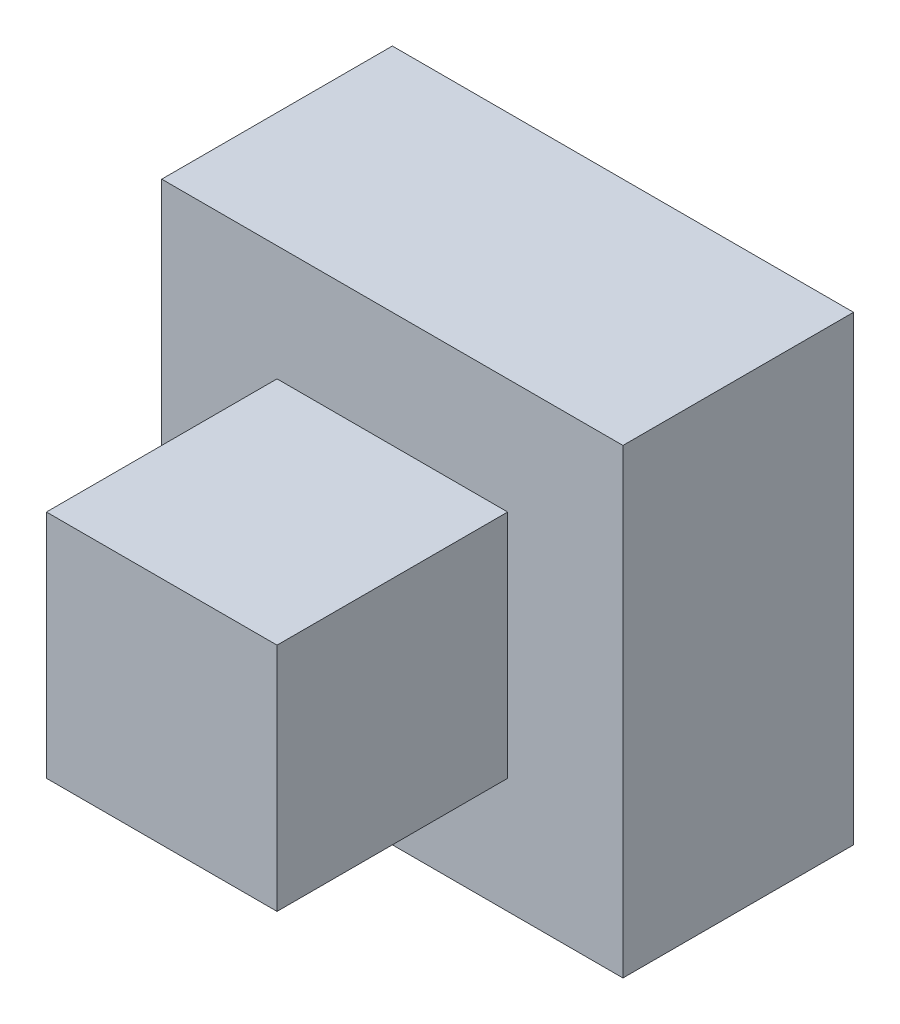
ISO-10303-21;
HEADER;
FILE_DESCRIPTION(('STEP AP214'),'2;1');
FILE_NAME('part.step','',(''),(''),'','','');
FILE_SCHEMA(('AUTOMOTIVE_DESIGN { 1 0 10303 214 1 1 1 1 }'));
ENDSEC;
DATA;
#1=APPLICATION_CONTEXT('core data for automotive mechanical design processes');
#2=APPLICATION_PROTOCOL_DEFINITION('international standard','automotive_design',2000,#1);
#3=PRODUCT_CONTEXT('',#1,'mechanical');
#4=PRODUCT('Part','Part','',(#3));
#5=PRODUCT_RELATED_PRODUCT_CATEGORY('part','',(#4));
#6=PRODUCT_DEFINITION_FORMATION('','',#4);
#7=PRODUCT_DEFINITION_CONTEXT('part definition',#1,'design');
#8=PRODUCT_DEFINITION('design','',#6,#7);
#9=PRODUCT_DEFINITION_SHAPE('','',#8);
#10=(LENGTH_UNIT() NAMED_UNIT(*) SI_UNIT(.MILLI.,.METRE.));
#11=(NAMED_UNIT(*) PLANE_ANGLE_UNIT() SI_UNIT($,.RADIAN.));
#12=(NAMED_UNIT(*) SI_UNIT($,.STERADIAN.) SOLID_ANGLE_UNIT());
#13=UNCERTAINTY_MEASURE_WITH_UNIT(LENGTH_MEASURE(1.E-05),#10,'distance_accuracy_value','');
#14=(GEOMETRIC_REPRESENTATION_CONTEXT(3) GLOBAL_UNCERTAINTY_ASSIGNED_CONTEXT((#13)) GLOBAL_UNIT_ASSIGNED_CONTEXT((#10,
#11,#12)) REPRESENTATION_CONTEXT('',''));
#15=CARTESIAN_POINT('',(0.,0.,0.));
#16=DIRECTION('',(0.,0.,1.));
#17=DIRECTION('',(1.,0.,0.));
#18=AXIS2_PLACEMENT_3D('',#15,#16,#17);
#19=CARTESIAN_POINT('',(0.,0.,10.));
#20=DIRECTION('',(0.,0.,-1.));
#21=DIRECTION('',(-1.,0.,0.));
#22=AXIS2_PLACEMENT_3D('',#19,#20,#21);
#23=PLANE('',#22);
#24=DIRECTION('',(0.,-1.,0.));
#25=VECTOR('',#24,1.);
#26=CARTESIAN_POINT('',(0.,0.,10.));
#27=LINE('',#26,#25);
#28=CARTESIAN_POINT('',(0.,20.,10.));
#29=VERTEX_POINT('',#28);
#30=CARTESIAN_POINT('',(0.,0.,10.));
#31=VERTEX_POINT('',#30);
#32=EDGE_CURVE('E140',#29,#31,#27,.T.);
#33=ORIENTED_EDGE('',*,*,#32,.T.);
#34=DIRECTION('',(1.,0.,0.));
#35=VECTOR('',#34,1.);
#36=CARTESIAN_POINT('',(0.,0.,10.));
#37=LINE('',#36,#35);
#38=CARTESIAN_POINT('',(20.,0.,10.));
#39=VERTEX_POINT('',#38);
#40=EDGE_CURVE('E141',#31,#39,#37,.T.);
#41=ORIENTED_EDGE('',*,*,#40,.T.);
#42=DIRECTION('',(0.,1.,0.));
#43=VECTOR('',#42,1.);
#44=CARTESIAN_POINT('',(20.,0.,10.));
#45=LINE('',#44,#43);
#46=CARTESIAN_POINT('',(20.,20.,10.));
#47=VERTEX_POINT('',#46);
#48=EDGE_CURVE('E148',#39,#47,#45,.T.);
#49=ORIENTED_EDGE('',*,*,#48,.T.);
#50=DIRECTION('',(-1.,0.,0.));
#51=VECTOR('',#50,1.);
#52=CARTESIAN_POINT('',(0.,20.,10.));
#53=LINE('',#52,#51);
#54=EDGE_CURVE('E146',#47,#29,#53,.T.);
#55=ORIENTED_EDGE('',*,*,#54,.T.);
#56=EDGE_LOOP('',(#33,#41,#49,#55));
#57=FACE_BOUND('',#56,.T.);
#58=DIRECTION('',(0.,-1.,0.));
#59=VECTOR('',#58,1.);
#60=CARTESIAN_POINT('',(5.,5.,10.));
#61=LINE('',#60,#59);
#62=CARTESIAN_POINT('',(5.,15.,10.));
#63=VERTEX_POINT('',#62);
#64=CARTESIAN_POINT('',(5.,5.,10.));
#65=VERTEX_POINT('',#64);
#66=EDGE_CURVE('E130',#63,#65,#61,.T.);
#67=ORIENTED_EDGE('',*,*,#66,.F.);
#68=DIRECTION('',(-1.,0.,0.));
#69=VECTOR('',#68,1.);
#70=CARTESIAN_POINT('',(5.,15.,10.));
#71=LINE('',#70,#69);
#72=CARTESIAN_POINT('',(15.,15.,10.));
#73=VERTEX_POINT('',#72);
#74=EDGE_CURVE('E136',#73,#63,#71,.T.);
#75=ORIENTED_EDGE('',*,*,#74,.F.);
#76=DIRECTION('',(0.,1.,0.));
#77=VECTOR('',#76,1.);
#78=CARTESIAN_POINT('',(15.,5.,10.));
#79=LINE('',#78,#77);
#80=CARTESIAN_POINT('',(15.,5.,10.));
#81=VERTEX_POINT('',#80);
#82=EDGE_CURVE('E62',#81,#73,#79,.T.);
#83=ORIENTED_EDGE('',*,*,#82,.F.);
#84=DIRECTION('',(1.,0.,0.));
#85=VECTOR('',#84,1.);
#86=CARTESIAN_POINT('',(5.,5.,10.));
#87=LINE('',#86,#85);
#88=EDGE_CURVE('E59',#65,#81,#87,.T.);
#89=ORIENTED_EDGE('',*,*,#88,.F.);
#90=EDGE_LOOP('',(#67,#75,#83,#89));
#91=FACE_BOUND('',#90,.T.);
#92=ADVANCED_FACE('F43',(#57,#91),#23,.F.);
#93=CARTESIAN_POINT('',(0.,0.,10.));
#94=DIRECTION('',(1.,0.,0.));
#95=DIRECTION('',(0.,0.,-1.));
#96=AXIS2_PLACEMENT_3D('',#93,#94,#95);
#97=PLANE('',#96);
#98=DIRECTION('',(0.,-1.,0.));
#99=VECTOR('',#98,1.);
#100=CARTESIAN_POINT('',(0.,0.,0.));
#101=LINE('',#100,#99);
#102=CARTESIAN_POINT('',(0.,20.,0.));
#103=VERTEX_POINT('',#102);
#104=CARTESIAN_POINT('',(0.,0.,0.));
#105=VERTEX_POINT('',#104);
#106=EDGE_CURVE('E138',#103,#105,#101,.T.);
#107=ORIENTED_EDGE('',*,*,#106,.T.);
#108=DIRECTION('',(0.,0.,-1.));
#109=VECTOR('',#108,1.);
#110=CARTESIAN_POINT('',(0.,0.,10.));
#111=LINE('',#110,#109);
#112=EDGE_CURVE('E11',#31,#105,#111,.T.);
#113=ORIENTED_EDGE('',*,*,#112,.F.);
#114=ORIENTED_EDGE('',*,*,#32,.F.);
#115=DIRECTION('',(0.,0.,-1.));
#116=VECTOR('',#115,1.);
#117=CARTESIAN_POINT('',(0.,20.,10.));
#118=LINE('',#117,#116);
#119=EDGE_CURVE('E147',#29,#103,#118,.T.);
#120=ORIENTED_EDGE('',*,*,#119,.T.);
#121=EDGE_LOOP('',(#107,#113,#114,#120));
#122=FACE_BOUND('',#121,.T.);
#123=ADVANCED_FACE('F44',(#122),#97,.F.);
#124=CARTESIAN_POINT('',(0.,0.,10.));
#125=DIRECTION('',(0.,1.,0.));
#126=DIRECTION('',(0.,0.,1.));
#127=AXIS2_PLACEMENT_3D('',#124,#125,#126);
#128=PLANE('',#127);
#129=DIRECTION('',(1.,0.,0.));
#130=VECTOR('',#129,1.);
#131=CARTESIAN_POINT('',(0.,0.,0.));
#132=LINE('',#131,#130);
#133=CARTESIAN_POINT('',(20.,0.,0.));
#134=VERTEX_POINT('',#133);
#135=EDGE_CURVE('E153',#105,#134,#132,.T.);
#136=ORIENTED_EDGE('',*,*,#135,.T.);
#137=DIRECTION('',(0.,0.,-1.));
#138=VECTOR('',#137,1.);
#139=CARTESIAN_POINT('',(20.,0.,10.));
#140=LINE('',#139,#138);
#141=EDGE_CURVE('E51',#39,#134,#140,.T.);
#142=ORIENTED_EDGE('',*,*,#141,.F.);
#143=ORIENTED_EDGE('',*,*,#40,.F.);
#144=ORIENTED_EDGE('',*,*,#112,.T.);
#145=EDGE_LOOP('',(#136,#142,#143,#144));
#146=FACE_BOUND('',#145,.T.);
#147=ADVANCED_FACE('F185',(#146),#128,.F.);
#148=CARTESIAN_POINT('',(20.,0.,10.));
#149=DIRECTION('',(-1.,0.,0.));
#150=DIRECTION('',(0.,0.,1.));
#151=AXIS2_PLACEMENT_3D('',#148,#149,#150);
#152=PLANE('',#151);
#153=DIRECTION('',(0.,1.,0.));
#154=VECTOR('',#153,1.);
#155=CARTESIAN_POINT('',(20.,0.,0.));
#156=LINE('',#155,#154);
#157=CARTESIAN_POINT('',(20.,20.,0.));
#158=VERTEX_POINT('',#157);
#159=EDGE_CURVE('E154',#134,#158,#156,.T.);
#160=ORIENTED_EDGE('',*,*,#159,.T.);
#161=DIRECTION('',(0.,0.,-1.));
#162=VECTOR('',#161,1.);
#163=CARTESIAN_POINT('',(20.,20.,10.));
#164=LINE('',#163,#162);
#165=EDGE_CURVE('E159',#47,#158,#164,.T.);
#166=ORIENTED_EDGE('',*,*,#165,.F.);
#167=ORIENTED_EDGE('',*,*,#48,.F.);
#168=ORIENTED_EDGE('',*,*,#141,.T.);
#169=EDGE_LOOP('',(#160,#166,#167,#168));
#170=FACE_BOUND('',#169,.T.);
#171=ADVANCED_FACE('F170',(#170),#152,.F.);
#172=CARTESIAN_POINT('',(0.,20.,10.));
#173=DIRECTION('',(0.,-1.,0.));
#174=DIRECTION('',(0.,0.,-1.));
#175=AXIS2_PLACEMENT_3D('',#172,#173,#174);
#176=PLANE('',#175);
#177=DIRECTION('',(-1.,0.,0.));
#178=VECTOR('',#177,1.);
#179=CARTESIAN_POINT('',(0.,20.,0.));
#180=LINE('',#179,#178);
#181=EDGE_CURVE('E145',#158,#103,#180,.T.);
#182=ORIENTED_EDGE('',*,*,#181,.T.);
#183=ORIENTED_EDGE('',*,*,#119,.F.);
#184=ORIENTED_EDGE('',*,*,#54,.F.);
#185=ORIENTED_EDGE('',*,*,#165,.T.);
#186=EDGE_LOOP('',(#182,#183,#184,#185));
#187=FACE_BOUND('',#186,.T.);
#188=ADVANCED_FACE('F176',(#187),#176,.F.);
#189=CARTESIAN_POINT('',(0.,0.,0.));
#190=DIRECTION('',(0.,0.,-1.));
#191=DIRECTION('',(-1.,0.,0.));
#192=AXIS2_PLACEMENT_3D('',#189,#190,#191);
#193=PLANE('',#192);
#194=ORIENTED_EDGE('',*,*,#106,.F.);
#195=ORIENTED_EDGE('',*,*,#181,.F.);
#196=ORIENTED_EDGE('',*,*,#159,.F.);
#197=ORIENTED_EDGE('',*,*,#135,.F.);
#198=EDGE_LOOP('',(#194,#195,#196,#197));
#199=FACE_BOUND('',#198,.T.);
#200=ADVANCED_FACE('F172',(#199),#193,.T.);
#201=CARTESIAN_POINT('',(5.,5.,20.));
#202=DIRECTION('',(1.,0.,0.));
#203=DIRECTION('',(0.,0.,-1.));
#204=AXIS2_PLACEMENT_3D('',#201,#202,#203);
#205=PLANE('',#204);
#206=ORIENTED_EDGE('',*,*,#66,.T.);
#207=DIRECTION('',(0.,0.,-1.));
#208=VECTOR('',#207,1.);
#209=CARTESIAN_POINT('',(5.,5.,20.));
#210=LINE('',#209,#208);
#211=CARTESIAN_POINT('',(5.,5.,20.));
#212=VERTEX_POINT('',#211);
#213=EDGE_CURVE('E108',#212,#65,#210,.T.);
#214=ORIENTED_EDGE('',*,*,#213,.F.);
#215=DIRECTION('',(0.,-1.,0.));
#216=VECTOR('',#215,1.);
#217=CARTESIAN_POINT('',(5.,5.,20.));
#218=LINE('',#217,#216);
#219=CARTESIAN_POINT('',(5.,15.,20.));
#220=VERTEX_POINT('',#219);
#221=EDGE_CURVE('E118',#220,#212,#218,.T.);
#222=ORIENTED_EDGE('',*,*,#221,.F.);
#223=DIRECTION('',(0.,0.,-1.));
#224=VECTOR('',#223,1.);
#225=CARTESIAN_POINT('',(5.,15.,20.));
#226=LINE('',#225,#224);
#227=EDGE_CURVE('E259',#220,#63,#226,.T.);
#228=ORIENTED_EDGE('',*,*,#227,.T.);
#229=EDGE_LOOP('',(#206,#214,#222,#228));
#230=FACE_BOUND('',#229,.T.);
#231=ADVANCED_FACE('F127',(#230),#205,.F.);
#232=CARTESIAN_POINT('',(5.,5.,20.));
#233=DIRECTION('',(0.,1.,0.));
#234=DIRECTION('',(0.,0.,1.));
#235=AXIS2_PLACEMENT_3D('',#232,#233,#234);
#236=PLANE('',#235);
#237=ORIENTED_EDGE('',*,*,#88,.T.);
#238=DIRECTION('',(0.,0.,-1.));
#239=VECTOR('',#238,1.);
#240=CARTESIAN_POINT('',(15.,5.,20.));
#241=LINE('',#240,#239);
#242=CARTESIAN_POINT('',(15.,5.,20.));
#243=VERTEX_POINT('',#242);
#244=EDGE_CURVE('E115',#243,#81,#241,.T.);
#245=ORIENTED_EDGE('',*,*,#244,.F.);
#246=DIRECTION('',(1.,0.,0.));
#247=VECTOR('',#246,1.);
#248=CARTESIAN_POINT('',(5.,5.,20.));
#249=LINE('',#248,#247);
#250=EDGE_CURVE('E104',#212,#243,#249,.T.);
#251=ORIENTED_EDGE('',*,*,#250,.F.);
#252=ORIENTED_EDGE('',*,*,#213,.T.);
#253=EDGE_LOOP('',(#237,#245,#251,#252));
#254=FACE_BOUND('',#253,.T.);
#255=ADVANCED_FACE('F110',(#254),#236,.F.);
#256=CARTESIAN_POINT('',(15.,5.,20.));
#257=DIRECTION('',(-1.,0.,0.));
#258=DIRECTION('',(0.,0.,1.));
#259=AXIS2_PLACEMENT_3D('',#256,#257,#258);
#260=PLANE('',#259);
#261=ORIENTED_EDGE('',*,*,#82,.T.);
#262=DIRECTION('',(0.,0.,-1.));
#263=VECTOR('',#262,1.);
#264=CARTESIAN_POINT('',(15.,15.,20.));
#265=LINE('',#264,#263);
#266=CARTESIAN_POINT('',(15.,15.,20.));
#267=VERTEX_POINT('',#266);
#268=EDGE_CURVE('E128',#267,#73,#265,.T.);
#269=ORIENTED_EDGE('',*,*,#268,.F.);
#270=DIRECTION('',(0.,1.,0.));
#271=VECTOR('',#270,1.);
#272=CARTESIAN_POINT('',(15.,5.,20.));
#273=LINE('',#272,#271);
#274=EDGE_CURVE('E113',#243,#267,#273,.T.);
#275=ORIENTED_EDGE('',*,*,#274,.F.);
#276=ORIENTED_EDGE('',*,*,#244,.T.);
#277=EDGE_LOOP('',(#261,#269,#275,#276));
#278=FACE_BOUND('',#277,.T.);
#279=ADVANCED_FACE('F230',(#278),#260,.F.);
#280=CARTESIAN_POINT('',(5.,15.,20.));
#281=DIRECTION('',(0.,-1.,0.));
#282=DIRECTION('',(0.,0.,-1.));
#283=AXIS2_PLACEMENT_3D('',#280,#281,#282);
#284=PLANE('',#283);
#285=ORIENTED_EDGE('',*,*,#74,.T.);
#286=ORIENTED_EDGE('',*,*,#227,.F.);
#287=DIRECTION('',(-1.,0.,0.));
#288=VECTOR('',#287,1.);
#289=CARTESIAN_POINT('',(5.,15.,20.));
#290=LINE('',#289,#288);
#291=EDGE_CURVE('E121',#267,#220,#290,.T.);
#292=ORIENTED_EDGE('',*,*,#291,.F.);
#293=ORIENTED_EDGE('',*,*,#268,.T.);
#294=EDGE_LOOP('',(#285,#286,#292,#293));
#295=FACE_BOUND('',#294,.T.);
#296=ADVANCED_FACE('F240',(#295),#284,.F.);
#297=CARTESIAN_POINT('',(0.,0.,20.));
#298=DIRECTION('',(0.,0.,-1.));
#299=DIRECTION('',(-1.,0.,0.));
#300=AXIS2_PLACEMENT_3D('',#297,#298,#299);
#301=PLANE('',#300);
#302=ORIENTED_EDGE('',*,*,#221,.T.);
#303=ORIENTED_EDGE('',*,*,#250,.T.);
#304=ORIENTED_EDGE('',*,*,#274,.T.);
#305=ORIENTED_EDGE('',*,*,#291,.T.);
#306=EDGE_LOOP('',(#302,#303,#304,#305));
#307=FACE_BOUND('',#306,.T.);
#308=ADVANCED_FACE('F120',(#307),#301,.F.);
#309=CLOSED_SHELL('',(#92,#123,#147,#171,#188,#200,#231,#255,#279,#296,#308));
#310=MANIFOLD_SOLID_BREP('B2',#309);
#311=ADVANCED_BREP_SHAPE_REPRESENTATION('',(#18,#310),#14);
#312=SHAPE_DEFINITION_REPRESENTATION(#9,#311);
ENDSEC;
END-ISO-10303-21;
